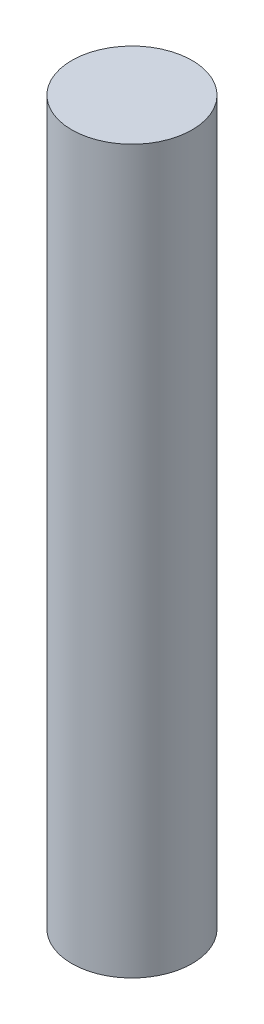
ISO-10303-21;
HEADER;
FILE_DESCRIPTION(('STEP AP214'),'2;1');
FILE_NAME('part.step','',(''),(''),'','','');
FILE_SCHEMA(('AUTOMOTIVE_DESIGN { 1 0 10303 214 1 1 1 1 }'));
ENDSEC;
DATA;
#1=APPLICATION_CONTEXT('core data for automotive mechanical design processes');
#2=APPLICATION_PROTOCOL_DEFINITION('international standard','automotive_design',2000,#1);
#3=PRODUCT_CONTEXT('',#1,'mechanical');
#4=PRODUCT('Part','Part','',(#3));
#5=PRODUCT_RELATED_PRODUCT_CATEGORY('part','',(#4));
#6=PRODUCT_DEFINITION_FORMATION('','',#4);
#7=PRODUCT_DEFINITION_CONTEXT('part definition',#1,'design');
#8=PRODUCT_DEFINITION('design','',#6,#7);
#9=PRODUCT_DEFINITION_SHAPE('','',#8);
#10=(LENGTH_UNIT() NAMED_UNIT(*) SI_UNIT(.MILLI.,.METRE.));
#11=(NAMED_UNIT(*) PLANE_ANGLE_UNIT() SI_UNIT($,.RADIAN.));
#12=(NAMED_UNIT(*) SI_UNIT($,.STERADIAN.) SOLID_ANGLE_UNIT());
#13=UNCERTAINTY_MEASURE_WITH_UNIT(LENGTH_MEASURE(1.E-05),#10,'distance_accuracy_value','');
#14=(GEOMETRIC_REPRESENTATION_CONTEXT(3) GLOBAL_UNCERTAINTY_ASSIGNED_CONTEXT((#13)) GLOBAL_UNIT_ASSIGNED_CONTEXT((#10,
#11,#12)) REPRESENTATION_CONTEXT('',''));
#15=CARTESIAN_POINT('',(0.,0.,0.));
#16=DIRECTION('',(0.,0.,1.));
#17=DIRECTION('',(1.,0.,0.));
#18=AXIS2_PLACEMENT_3D('',#15,#16,#17);
#19=CARTESIAN_POINT('',(-123.63241418986,2250.,140.965514086201));
#20=DIRECTION('',(0.,-1.,0.));
#21=DIRECTION('',(0.,0.,-1.));
#22=AXIS2_PLACEMENT_3D('',#19,#20,#21);
#23=CYLINDRICAL_SURFACE('',#22,187.5);
#24=CARTESIAN_POINT('',(-123.63241418986,2250.,140.965514086201));
#25=DIRECTION('',(0.,1.,0.));
#26=DIRECTION('',(0.,0.,1.));
#27=AXIS2_PLACEMENT_3D('',#24,#25,#26);
#28=CIRCLE('',#27,187.5);
#29=CARTESIAN_POINT('',(-123.63241418986,2250.,328.465514086201));
#30=VERTEX_POINT('',#29);
#31=EDGE_CURVE('E10',#30,#30,#28,.T.);
#32=ORIENTED_EDGE('',*,*,#31,.F.);
#33=EDGE_LOOP('',(#32));
#34=FACE_BOUND('',#33,.T.);
#35=CARTESIAN_POINT('',(-123.63241418986,0.,140.965514086201));
#36=DIRECTION('',(0.,1.,0.));
#37=DIRECTION('',(0.,0.,1.));
#38=AXIS2_PLACEMENT_3D('',#35,#36,#37);
#39=CIRCLE('',#38,187.5);
#40=CARTESIAN_POINT('',(-123.63241418986,0.,328.465514086201));
#41=VERTEX_POINT('',#40);
#42=EDGE_CURVE('E34',#41,#41,#39,.T.);
#43=ORIENTED_EDGE('',*,*,#42,.T.);
#44=EDGE_LOOP('',(#43));
#45=FACE_BOUND('',#44,.T.);
#46=ADVANCED_FACE('F31',(#34,#45),#23,.T.);
#47=CARTESIAN_POINT('',(-123.63241418986,2250.,140.965514086201));
#48=DIRECTION('',(0.,1.,0.));
#49=DIRECTION('',(0.,0.,1.));
#50=AXIS2_PLACEMENT_3D('',#47,#48,#49);
#51=PLANE('',#50);
#52=ORIENTED_EDGE('',*,*,#31,.T.);
#53=EDGE_LOOP('',(#52));
#54=FACE_BOUND('',#53,.T.);
#55=ADVANCED_FACE('F46',(#54),#51,.T.);
#56=CARTESIAN_POINT('',(-123.63241418986,0.,140.965514086201));
#57=DIRECTION('',(0.,1.,0.));
#58=DIRECTION('',(0.,0.,1.));
#59=AXIS2_PLACEMENT_3D('',#56,#57,#58);
#60=PLANE('',#59);
#61=ORIENTED_EDGE('',*,*,#42,.F.);
#62=EDGE_LOOP('',(#61));
#63=FACE_BOUND('',#62,.T.);
#64=ADVANCED_FACE('F44',(#63),#60,.F.);
#65=CLOSED_SHELL('',(#46,#55,#64));
#66=MANIFOLD_SOLID_BREP('B2',#65);
#67=ADVANCED_BREP_SHAPE_REPRESENTATION('',(#18,#66),#14);
#68=SHAPE_DEFINITION_REPRESENTATION(#9,#67);
ENDSEC;
END-ISO-10303-21;
